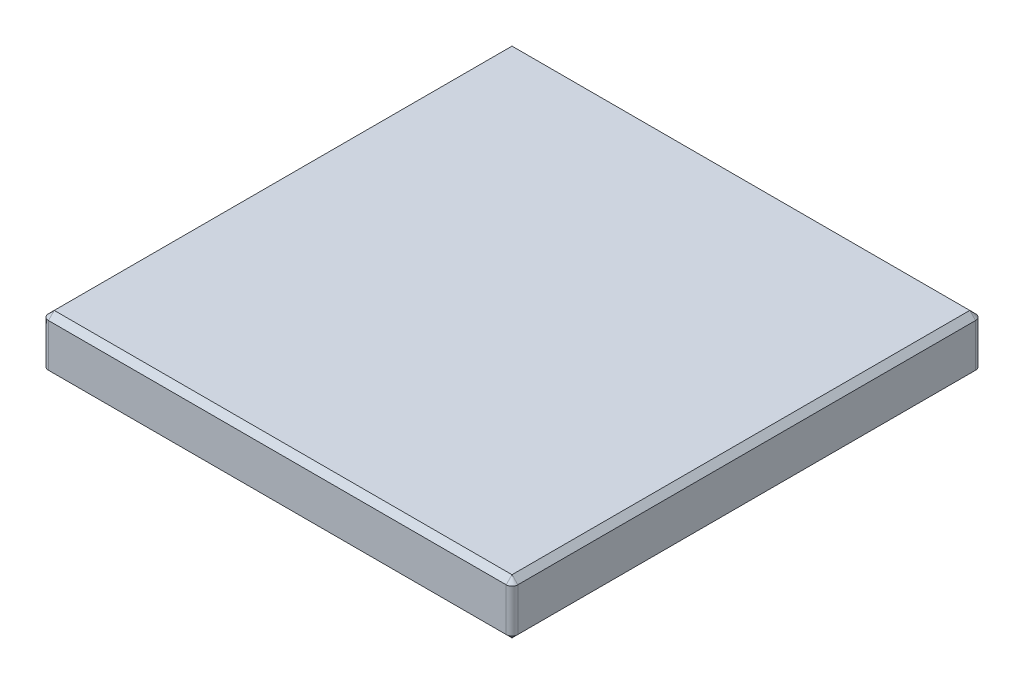
ISO-10303-21;
HEADER;
FILE_DESCRIPTION(('STEP AP214'),'2;1');
FILE_NAME('part.step','',(''),(''),'','','');
FILE_SCHEMA(('AUTOMOTIVE_DESIGN { 1 0 10303 214 1 1 1 1 }'));
ENDSEC;
DATA;
#1=APPLICATION_CONTEXT('core data for automotive mechanical design processes');
#2=APPLICATION_PROTOCOL_DEFINITION('international standard','automotive_design',2000,#1);
#3=PRODUCT_CONTEXT('',#1,'mechanical');
#4=PRODUCT('Part','Part','',(#3));
#5=PRODUCT_RELATED_PRODUCT_CATEGORY('part','',(#4));
#6=PRODUCT_DEFINITION_FORMATION('','',#4);
#7=PRODUCT_DEFINITION_CONTEXT('part definition',#1,'design');
#8=PRODUCT_DEFINITION('design','',#6,#7);
#9=PRODUCT_DEFINITION_SHAPE('','',#8);
#10=(LENGTH_UNIT() NAMED_UNIT(*) SI_UNIT(.MILLI.,.METRE.));
#11=(NAMED_UNIT(*) PLANE_ANGLE_UNIT() SI_UNIT($,.RADIAN.));
#12=(NAMED_UNIT(*) SI_UNIT($,.STERADIAN.) SOLID_ANGLE_UNIT());
#13=UNCERTAINTY_MEASURE_WITH_UNIT(LENGTH_MEASURE(1.E-05),#10,'distance_accuracy_value','');
#14=(GEOMETRIC_REPRESENTATION_CONTEXT(3) GLOBAL_UNCERTAINTY_ASSIGNED_CONTEXT((#13)) GLOBAL_UNIT_ASSIGNED_CONTEXT((#10,
#11,#12)) REPRESENTATION_CONTEXT('',''));
#15=CARTESIAN_POINT('',(0.,0.,0.));
#16=DIRECTION('',(0.,0.,1.));
#17=DIRECTION('',(1.,0.,0.));
#18=AXIS2_PLACEMENT_3D('',#15,#16,#17);
#19=CARTESIAN_POINT('',(201.5,47.,201.5));
#20=DIRECTION('',(-1.,0.,0.));
#21=DIRECTION('',(0.,0.,1.));
#22=AXIS2_PLACEMENT_3D('',#19,#20,#21);
#23=PLANE('',#22);
#24=DIRECTION('',(0.,-1.,0.));
#25=VECTOR('',#24,1.);
#26=CARTESIAN_POINT('',(201.5,47.,196.5));
#27=LINE('',#26,#25);
#28=CARTESIAN_POINT('',(201.5,42.,196.5));
#29=VERTEX_POINT('',#28);
#30=CARTESIAN_POINT('',(201.5,5.00000000000006,196.5));
#31=VERTEX_POINT('',#30);
#32=EDGE_CURVE('E151',#29,#31,#27,.T.);
#33=ORIENTED_EDGE('',*,*,#32,.T.);
#34=DIRECTION('',(0.,0.,-1.));
#35=VECTOR('',#34,1.);
#36=CARTESIAN_POINT('',(201.5,5.00000000000006,-196.5));
#37=LINE('',#36,#35);
#38=CARTESIAN_POINT('',(201.5,5.00000000000006,-196.5));
#39=VERTEX_POINT('',#38);
#40=EDGE_CURVE('E170',#31,#39,#37,.T.);
#41=ORIENTED_EDGE('',*,*,#40,.T.);
#42=DIRECTION('',(0.,-1.,0.));
#43=VECTOR('',#42,1.);
#44=CARTESIAN_POINT('',(201.5,47.,-196.5));
#45=LINE('',#44,#43);
#46=CARTESIAN_POINT('',(201.5,42.,-196.5));
#47=VERTEX_POINT('',#46);
#48=EDGE_CURVE('E503',#39,#47,#45,.F.);
#49=ORIENTED_EDGE('',*,*,#48,.T.);
#50=DIRECTION('',(0.,0.,1.));
#51=VECTOR('',#50,1.);
#52=CARTESIAN_POINT('',(201.5,42.,201.5));
#53=LINE('',#52,#51);
#54=EDGE_CURVE('E162',#47,#29,#53,.T.);
#55=ORIENTED_EDGE('',*,*,#54,.T.);
#56=EDGE_LOOP('',(#33,#41,#49,#55));
#57=FACE_BOUND('',#56,.T.);
#58=ADVANCED_FACE('F34',(#57),#23,.F.);
#59=CARTESIAN_POINT('',(-201.5,47.,-201.5));
#60=DIRECTION('',(0.,0.,1.));
#61=DIRECTION('',(1.,0.,0.));
#62=AXIS2_PLACEMENT_3D('',#59,#60,#61);
#63=PLANE('',#62);
#64=DIRECTION('',(0.,-1.,0.));
#65=VECTOR('',#64,1.);
#66=CARTESIAN_POINT('',(196.5,47.,-201.5));
#67=LINE('',#66,#65);
#68=CARTESIAN_POINT('',(196.5,42.,-201.5));
#69=VERTEX_POINT('',#68);
#70=CARTESIAN_POINT('',(196.5,5.00000000000006,-201.5));
#71=VERTEX_POINT('',#70);
#72=EDGE_CURVE('E132',#69,#71,#67,.T.);
#73=ORIENTED_EDGE('',*,*,#72,.T.);
#74=DIRECTION('',(-1.,0.,0.));
#75=VECTOR('',#74,1.);
#76=CARTESIAN_POINT('',(-196.5,5.00000000000006,-201.5));
#77=LINE('',#76,#75);
#78=CARTESIAN_POINT('',(-196.5,5.00000000000006,-201.5));
#79=VERTEX_POINT('',#78);
#80=EDGE_CURVE('E140',#71,#79,#77,.T.);
#81=ORIENTED_EDGE('',*,*,#80,.T.);
#82=DIRECTION('',(0.,-1.,0.));
#83=VECTOR('',#82,1.);
#84=CARTESIAN_POINT('',(-196.5,47.,-201.5));
#85=LINE('',#84,#83);
#86=CARTESIAN_POINT('',(-196.5,42.,-201.5));
#87=VERTEX_POINT('',#86);
#88=EDGE_CURVE('E135',#79,#87,#85,.F.);
#89=ORIENTED_EDGE('',*,*,#88,.T.);
#90=DIRECTION('',(1.,0.,0.));
#91=VECTOR('',#90,1.);
#92=CARTESIAN_POINT('',(-201.5,42.,-201.5));
#93=LINE('',#92,#91);
#94=EDGE_CURVE('E128',#87,#69,#93,.T.);
#95=ORIENTED_EDGE('',*,*,#94,.T.);
#96=EDGE_LOOP('',(#73,#81,#89,#95));
#97=FACE_BOUND('',#96,.T.);
#98=ADVANCED_FACE('F130',(#97),#63,.F.);
#99=CARTESIAN_POINT('',(-201.5,47.,201.5));
#100=DIRECTION('',(1.,0.,0.));
#101=DIRECTION('',(0.,0.,-1.));
#102=AXIS2_PLACEMENT_3D('',#99,#100,#101);
#103=PLANE('',#102);
#104=DIRECTION('',(0.,-1.,0.));
#105=VECTOR('',#104,1.);
#106=CARTESIAN_POINT('',(-201.5,47.,-196.5));
#107=LINE('',#106,#105);
#108=CARTESIAN_POINT('',(-201.5,42.,-196.5));
#109=VERTEX_POINT('',#108);
#110=CARTESIAN_POINT('',(-201.5,5.00000000000006,-196.5));
#111=VERTEX_POINT('',#110);
#112=EDGE_CURVE('E141',#109,#111,#107,.T.);
#113=ORIENTED_EDGE('',*,*,#112,.T.);
#114=DIRECTION('',(0.,0.,1.));
#115=VECTOR('',#114,1.);
#116=CARTESIAN_POINT('',(-201.5,5.00000000000006,196.5));
#117=LINE('',#116,#115);
#118=CARTESIAN_POINT('',(-201.5,5.00000000000006,196.5));
#119=VERTEX_POINT('',#118);
#120=EDGE_CURVE('E227',#111,#119,#117,.T.);
#121=ORIENTED_EDGE('',*,*,#120,.T.);
#122=DIRECTION('',(0.,-1.,0.));
#123=VECTOR('',#122,1.);
#124=CARTESIAN_POINT('',(-201.5,47.,196.5));
#125=LINE('',#124,#123);
#126=CARTESIAN_POINT('',(-201.5,42.,196.5));
#127=VERTEX_POINT('',#126);
#128=EDGE_CURVE('E263',#119,#127,#125,.F.);
#129=ORIENTED_EDGE('',*,*,#128,.T.);
#130=DIRECTION('',(0.,0.,-1.));
#131=VECTOR('',#130,1.);
#132=CARTESIAN_POINT('',(-201.5,42.,201.5));
#133=LINE('',#132,#131);
#134=EDGE_CURVE('E222',#127,#109,#133,.T.);
#135=ORIENTED_EDGE('',*,*,#134,.T.);
#136=EDGE_LOOP('',(#113,#121,#129,#135));
#137=FACE_BOUND('',#136,.T.);
#138=ADVANCED_FACE('F281',(#137),#103,.F.);
#139=CARTESIAN_POINT('',(-201.5,47.,201.5));
#140=DIRECTION('',(0.,0.,-1.));
#141=DIRECTION('',(-1.,0.,0.));
#142=AXIS2_PLACEMENT_3D('',#139,#140,#141);
#143=PLANE('',#142);
#144=DIRECTION('',(0.,-1.,0.));
#145=VECTOR('',#144,1.);
#146=CARTESIAN_POINT('',(-196.5,47.,201.5));
#147=LINE('',#146,#145);
#148=CARTESIAN_POINT('',(-196.5,42.,201.5));
#149=VERTEX_POINT('',#148);
#150=CARTESIAN_POINT('',(-196.5,5.00000000000006,201.5));
#151=VERTEX_POINT('',#150);
#152=EDGE_CURVE('E264',#149,#151,#147,.T.);
#153=ORIENTED_EDGE('',*,*,#152,.T.);
#154=DIRECTION('',(1.,0.,0.));
#155=VECTOR('',#154,1.);
#156=CARTESIAN_POINT('',(196.5,5.00000000000006,201.5));
#157=LINE('',#156,#155);
#158=CARTESIAN_POINT('',(196.5,5.00000000000006,201.5));
#159=VERTEX_POINT('',#158);
#160=EDGE_CURVE('E238',#151,#159,#157,.T.);
#161=ORIENTED_EDGE('',*,*,#160,.T.);
#162=DIRECTION('',(0.,-1.,0.));
#163=VECTOR('',#162,1.);
#164=CARTESIAN_POINT('',(196.5,47.,201.5));
#165=LINE('',#164,#163);
#166=CARTESIAN_POINT('',(196.5,42.,201.5));
#167=VERTEX_POINT('',#166);
#168=EDGE_CURVE('E252',#159,#167,#165,.F.);
#169=ORIENTED_EDGE('',*,*,#168,.T.);
#170=DIRECTION('',(-1.,0.,0.));
#171=VECTOR('',#170,1.);
#172=CARTESIAN_POINT('',(-201.5,42.,201.5));
#173=LINE('',#172,#171);
#174=EDGE_CURVE('E230',#167,#149,#173,.T.);
#175=ORIENTED_EDGE('',*,*,#174,.T.);
#176=EDGE_LOOP('',(#153,#161,#169,#175));
#177=FACE_BOUND('',#176,.T.);
#178=ADVANCED_FACE('F260',(#177),#143,.F.);
#179=CARTESIAN_POINT('',(0.,47.,0.));
#180=DIRECTION('',(0.,-1.,0.));
#181=DIRECTION('',(0.,0.,-1.));
#182=AXIS2_PLACEMENT_3D('',#179,#180,#181);
#183=PLANE('',#182);
#184=DIRECTION('',(1.,0.,0.));
#185=VECTOR('',#184,1.);
#186=CARTESIAN_POINT('',(0.,47.,196.5));
#187=LINE('',#186,#185);
#188=CARTESIAN_POINT('',(-196.5,47.,196.5));
#189=VERTEX_POINT('',#188);
#190=CARTESIAN_POINT('',(196.5,47.,196.5));
#191=VERTEX_POINT('',#190);
#192=EDGE_CURVE('E172',#189,#191,#187,.T.);
#193=ORIENTED_EDGE('',*,*,#192,.T.);
#194=DIRECTION('',(0.,0.,-1.));
#195=VECTOR('',#194,1.);
#196=CARTESIAN_POINT('',(196.5,47.,0.));
#197=LINE('',#196,#195);
#198=CARTESIAN_POINT('',(196.5,47.,-196.5));
#199=VERTEX_POINT('',#198);
#200=EDGE_CURVE('E11',#191,#199,#197,.T.);
#201=ORIENTED_EDGE('',*,*,#200,.T.);
#202=DIRECTION('',(-1.,0.,0.));
#203=VECTOR('',#202,1.);
#204=CARTESIAN_POINT('',(0.,47.,-196.5));
#205=LINE('',#204,#203);
#206=CARTESIAN_POINT('',(-196.5,47.,-196.5));
#207=VERTEX_POINT('',#206);
#208=EDGE_CURVE('E44',#199,#207,#205,.T.);
#209=ORIENTED_EDGE('',*,*,#208,.T.);
#210=DIRECTION('',(0.,0.,1.));
#211=VECTOR('',#210,1.);
#212=CARTESIAN_POINT('',(-196.5,47.,0.));
#213=LINE('',#212,#211);
#214=EDGE_CURVE('E174',#207,#189,#213,.T.);
#215=ORIENTED_EDGE('',*,*,#214,.T.);
#216=EDGE_LOOP('',(#193,#201,#209,#215));
#217=FACE_BOUND('',#216,.T.);
#218=ADVANCED_FACE('F271',(#217),#183,.F.);
#219=CARTESIAN_POINT('',(0.,0.,0.));
#220=DIRECTION('',(0.,-1.,0.));
#221=DIRECTION('',(0.,0.,-1.));
#222=AXIS2_PLACEMENT_3D('',#219,#220,#221);
#223=PLANE('',#222);
#224=DIRECTION('',(0.,0.,-1.));
#225=VECTOR('',#224,1.);
#226=CARTESIAN_POINT('',(-196.5,0.,-196.5));
#227=LINE('',#226,#225);
#228=CARTESIAN_POINT('',(-196.5,0.,196.5));
#229=VERTEX_POINT('',#228);
#230=CARTESIAN_POINT('',(-196.5,0.,-196.5));
#231=VERTEX_POINT('',#230);
#232=EDGE_CURVE('E233',#229,#231,#227,.T.);
#233=ORIENTED_EDGE('',*,*,#232,.T.);
#234=DIRECTION('',(1.,0.,0.));
#235=VECTOR('',#234,1.);
#236=CARTESIAN_POINT('',(196.5,0.,-196.5));
#237=LINE('',#236,#235);
#238=CARTESIAN_POINT('',(196.5,0.,-196.5));
#239=VERTEX_POINT('',#238);
#240=EDGE_CURVE('E228',#231,#239,#237,.T.);
#241=ORIENTED_EDGE('',*,*,#240,.T.);
#242=DIRECTION('',(0.,0.,1.));
#243=VECTOR('',#242,1.);
#244=CARTESIAN_POINT('',(196.5,0.,196.5));
#245=LINE('',#244,#243);
#246=CARTESIAN_POINT('',(196.5,0.,196.5));
#247=VERTEX_POINT('',#246);
#248=EDGE_CURVE('E493',#239,#247,#245,.T.);
#249=ORIENTED_EDGE('',*,*,#248,.T.);
#250=DIRECTION('',(-1.,0.,0.));
#251=VECTOR('',#250,1.);
#252=CARTESIAN_POINT('',(-196.5,0.,196.5));
#253=LINE('',#252,#251);
#254=EDGE_CURVE('E495',#247,#229,#253,.T.);
#255=ORIENTED_EDGE('',*,*,#254,.T.);
#256=EDGE_LOOP('',(#233,#241,#249,#255));
#257=FACE_BOUND('',#256,.T.);
#258=ADVANCED_FACE('F273',(#257),#223,.T.);
#259=CARTESIAN_POINT('',(196.5,47.,-196.5));
#260=DIRECTION('',(0.,-1.,0.));
#261=DIRECTION('',(0.,0.,-1.));
#262=AXIS2_PLACEMENT_3D('',#259,#260,#261);
#263=CYLINDRICAL_SURFACE('',#262,5.);
#264=ORIENTED_EDGE('',*,*,#48,.F.);
#265=CARTESIAN_POINT('',(196.5,5.00000000000006,-196.5));
#266=DIRECTION('',(0.,-1.,0.));
#267=DIRECTION('',(0.,0.,-1.));
#268=AXIS2_PLACEMENT_3D('',#265,#266,#267);
#269=CIRCLE('',#268,5.);
#270=EDGE_CURVE('E150',#39,#71,#269,.F.);
#271=ORIENTED_EDGE('',*,*,#270,.T.);
#272=ORIENTED_EDGE('',*,*,#72,.F.);
#273=CARTESIAN_POINT('',(196.5,42.,-196.5));
#274=DIRECTION('',(0.,-1.,0.));
#275=DIRECTION('',(0.,0.,-1.));
#276=AXIS2_PLACEMENT_3D('',#273,#274,#275);
#277=CIRCLE('',#276,5.);
#278=EDGE_CURVE('E147',#69,#47,#277,.T.);
#279=ORIENTED_EDGE('',*,*,#278,.T.);
#280=EDGE_LOOP('',(#264,#271,#272,#279));
#281=FACE_BOUND('',#280,.T.);
#282=ADVANCED_FACE('F145',(#281),#263,.T.);
#283=CARTESIAN_POINT('',(196.5,47.,196.5));
#284=DIRECTION('',(0.,-1.,0.));
#285=DIRECTION('',(0.,0.,-1.));
#286=AXIS2_PLACEMENT_3D('',#283,#284,#285);
#287=CYLINDRICAL_SURFACE('',#286,5.);
#288=ORIENTED_EDGE('',*,*,#168,.F.);
#289=CARTESIAN_POINT('',(196.5,5.00000000000006,196.5));
#290=DIRECTION('',(0.,-1.,0.));
#291=DIRECTION('',(0.,0.,-1.));
#292=AXIS2_PLACEMENT_3D('',#289,#290,#291);
#293=CIRCLE('',#292,5.);
#294=EDGE_CURVE('E160',#159,#31,#293,.F.);
#295=ORIENTED_EDGE('',*,*,#294,.T.);
#296=ORIENTED_EDGE('',*,*,#32,.F.);
#297=CARTESIAN_POINT('',(196.5,42.,196.5));
#298=DIRECTION('',(0.,-1.,0.));
#299=DIRECTION('',(0.,0.,-1.));
#300=AXIS2_PLACEMENT_3D('',#297,#298,#299);
#301=CIRCLE('',#300,5.);
#302=EDGE_CURVE('E164',#29,#167,#301,.T.);
#303=ORIENTED_EDGE('',*,*,#302,.T.);
#304=EDGE_LOOP('',(#288,#295,#296,#303));
#305=FACE_BOUND('',#304,.T.);
#306=ADVANCED_FACE('F251',(#305),#287,.T.);
#307=CARTESIAN_POINT('',(-196.5,47.,-196.5));
#308=DIRECTION('',(0.,-1.,0.));
#309=DIRECTION('',(0.,0.,-1.));
#310=AXIS2_PLACEMENT_3D('',#307,#308,#309);
#311=CYLINDRICAL_SURFACE('',#310,5.);
#312=ORIENTED_EDGE('',*,*,#88,.F.);
#313=CARTESIAN_POINT('',(-196.5,5.00000000000006,-196.5));
#314=DIRECTION('',(0.,-1.,0.));
#315=DIRECTION('',(0.,0.,-1.));
#316=AXIS2_PLACEMENT_3D('',#313,#314,#315);
#317=CIRCLE('',#316,5.);
#318=EDGE_CURVE('E245',#79,#111,#317,.F.);
#319=ORIENTED_EDGE('',*,*,#318,.T.);
#320=ORIENTED_EDGE('',*,*,#112,.F.);
#321=CARTESIAN_POINT('',(-196.5,42.,-196.5));
#322=DIRECTION('',(0.,-1.,0.));
#323=DIRECTION('',(0.,0.,-1.));
#324=AXIS2_PLACEMENT_3D('',#321,#322,#323);
#325=CIRCLE('',#324,5.);
#326=EDGE_CURVE('E243',#109,#87,#325,.T.);
#327=ORIENTED_EDGE('',*,*,#326,.T.);
#328=EDGE_LOOP('',(#312,#319,#320,#327));
#329=FACE_BOUND('',#328,.T.);
#330=ADVANCED_FACE('F296',(#329),#311,.T.);
#331=CARTESIAN_POINT('',(-196.5,47.,196.5));
#332=DIRECTION('',(0.,-1.,0.));
#333=DIRECTION('',(0.,0.,-1.));
#334=AXIS2_PLACEMENT_3D('',#331,#332,#333);
#335=CYLINDRICAL_SURFACE('',#334,5.);
#336=ORIENTED_EDGE('',*,*,#128,.F.);
#337=CARTESIAN_POINT('',(-196.5,5.00000000000006,196.5));
#338=DIRECTION('',(0.,-1.,0.));
#339=DIRECTION('',(0.,0.,-1.));
#340=AXIS2_PLACEMENT_3D('',#337,#338,#339);
#341=CIRCLE('',#340,5.);
#342=EDGE_CURVE('E241',#119,#151,#341,.F.);
#343=ORIENTED_EDGE('',*,*,#342,.T.);
#344=ORIENTED_EDGE('',*,*,#152,.F.);
#345=CARTESIAN_POINT('',(-196.5,42.,196.5));
#346=DIRECTION('',(0.,-1.,0.));
#347=DIRECTION('',(0.,0.,-1.));
#348=AXIS2_PLACEMENT_3D('',#345,#346,#347);
#349=CIRCLE('',#348,5.);
#350=EDGE_CURVE('E218',#149,#127,#349,.T.);
#351=ORIENTED_EDGE('',*,*,#350,.T.);
#352=EDGE_LOOP('',(#336,#343,#344,#351));
#353=FACE_BOUND('',#352,.T.);
#354=ADVANCED_FACE('F299',(#353),#335,.T.);
#355=CARTESIAN_POINT('',(-201.5,5.00000000000006,201.5));
#356=DIRECTION('',(0.,-0.707106781186543,0.707106781186551));
#357=DIRECTION('',(-1.,0.,0.));
#358=AXIS2_PLACEMENT_3D('',#355,#356,#357);
#359=PLANE('',#358);
#360=DIRECTION('',(0.,-0.707106781186551,-0.707106781186543));
#361=VECTOR('',#360,1.);
#362=CARTESIAN_POINT('',(196.5,5.00000000000006,201.5));
#363=LINE('',#362,#361);
#364=EDGE_CURVE('E196',#159,#247,#363,.T.);
#365=ORIENTED_EDGE('',*,*,#364,.F.);
#366=ORIENTED_EDGE('',*,*,#160,.F.);
#367=DIRECTION('',(0.,0.707106781186551,0.707106781186543));
#368=VECTOR('',#367,1.);
#369=CARTESIAN_POINT('',(-196.5,0.,196.5));
#370=LINE('',#369,#368);
#371=EDGE_CURVE('E193',#229,#151,#370,.T.);
#372=ORIENTED_EDGE('',*,*,#371,.F.);
#373=ORIENTED_EDGE('',*,*,#254,.F.);
#374=EDGE_LOOP('',(#365,#366,#372,#373));
#375=FACE_BOUND('',#374,.T.);
#376=ADVANCED_FACE('F303',(#375),#359,.T.);
#377=CARTESIAN_POINT('',(196.5,5.00000000000006,196.5));
#378=DIRECTION('',(0.,1.,0.));
#379=DIRECTION('',(0.,0.,1.));
#380=AXIS2_PLACEMENT_3D('',#377,#378,#379);
#381=CONICAL_SURFACE('',#380,5.,0.785398163397443);
#382=ORIENTED_EDGE('',*,*,#294,.F.);
#383=ORIENTED_EDGE('',*,*,#364,.T.);
#384=DIRECTION('',(-0.707106781186543,-0.707106781186551,0.));
#385=VECTOR('',#384,1.);
#386=CARTESIAN_POINT('',(201.5,5.00000000000006,196.5));
#387=LINE('',#386,#385);
#388=EDGE_CURVE('E190',#31,#247,#387,.T.);
#389=ORIENTED_EDGE('',*,*,#388,.F.);
#390=EDGE_LOOP('',(#382,#383,#389));
#391=FACE_BOUND('',#390,.T.);
#392=ADVANCED_FACE('F347',(#391),#381,.T.);
#393=CARTESIAN_POINT('',(-196.5,5.00000000000006,196.5));
#394=DIRECTION('',(0.,1.,0.));
#395=DIRECTION('',(0.,0.,1.));
#396=AXIS2_PLACEMENT_3D('',#393,#394,#395);
#397=CONICAL_SURFACE('',#396,5.,0.785398163397443);
#398=ORIENTED_EDGE('',*,*,#371,.T.);
#399=ORIENTED_EDGE('',*,*,#342,.F.);
#400=DIRECTION('',(-0.707106781186543,0.707106781186551,0.));
#401=VECTOR('',#400,1.);
#402=CARTESIAN_POINT('',(-196.5,0.,196.5));
#403=LINE('',#402,#401);
#404=EDGE_CURVE('E187',#229,#119,#403,.T.);
#405=ORIENTED_EDGE('',*,*,#404,.F.);
#406=EDGE_LOOP('',(#398,#399,#405));
#407=FACE_BOUND('',#406,.T.);
#408=ADVANCED_FACE('F340',(#407),#397,.T.);
#409=CARTESIAN_POINT('',(201.5,5.00000000000006,201.5));
#410=DIRECTION('',(0.707106781186551,-0.707106781186543,0.));
#411=DIRECTION('',(0.,0.,1.));
#412=AXIS2_PLACEMENT_3D('',#409,#410,#411);
#413=PLANE('',#412);
#414=ORIENTED_EDGE('',*,*,#388,.T.);
#415=ORIENTED_EDGE('',*,*,#248,.F.);
#416=DIRECTION('',(-0.707106781186543,-0.707106781186551,0.));
#417=VECTOR('',#416,1.);
#418=CARTESIAN_POINT('',(201.5,5.00000000000006,-196.5));
#419=LINE('',#418,#417);
#420=EDGE_CURVE('E184',#39,#239,#419,.T.);
#421=ORIENTED_EDGE('',*,*,#420,.F.);
#422=ORIENTED_EDGE('',*,*,#40,.F.);
#423=EDGE_LOOP('',(#414,#415,#421,#422));
#424=FACE_BOUND('',#423,.T.);
#425=ADVANCED_FACE('F333',(#424),#413,.T.);
#426=CARTESIAN_POINT('',(-201.5,5.00000000000006,201.5));
#427=DIRECTION('',(-0.707106781186551,-0.707106781186543,0.));
#428=DIRECTION('',(0.,0.,-1.));
#429=AXIS2_PLACEMENT_3D('',#426,#427,#428);
#430=PLANE('',#429);
#431=ORIENTED_EDGE('',*,*,#404,.T.);
#432=ORIENTED_EDGE('',*,*,#120,.F.);
#433=DIRECTION('',(-0.707106781186543,0.707106781186551,0.));
#434=VECTOR('',#433,1.);
#435=CARTESIAN_POINT('',(-196.5,0.,-196.5));
#436=LINE('',#435,#434);
#437=EDGE_CURVE('E181',#231,#111,#436,.T.);
#438=ORIENTED_EDGE('',*,*,#437,.F.);
#439=ORIENTED_EDGE('',*,*,#232,.F.);
#440=EDGE_LOOP('',(#431,#432,#438,#439));
#441=FACE_BOUND('',#440,.T.);
#442=ADVANCED_FACE('F326',(#441),#430,.T.);
#443=CARTESIAN_POINT('',(196.5,5.00000000000006,-196.5));
#444=DIRECTION('',(0.,1.,0.));
#445=DIRECTION('',(0.,0.,1.));
#446=AXIS2_PLACEMENT_3D('',#443,#444,#445);
#447=CONICAL_SURFACE('',#446,5.,0.785398163397443);
#448=ORIENTED_EDGE('',*,*,#270,.F.);
#449=ORIENTED_EDGE('',*,*,#420,.T.);
#450=DIRECTION('',(0.,-0.707106781186551,0.707106781186543));
#451=VECTOR('',#450,1.);
#452=CARTESIAN_POINT('',(196.5,5.00000000000006,-201.5));
#453=LINE('',#452,#451);
#454=EDGE_CURVE('E179',#71,#239,#453,.T.);
#455=ORIENTED_EDGE('',*,*,#454,.F.);
#456=EDGE_LOOP('',(#448,#449,#455));
#457=FACE_BOUND('',#456,.T.);
#458=ADVANCED_FACE('F319',(#457),#447,.T.);
#459=CARTESIAN_POINT('',(-196.5,5.00000000000006,-196.5));
#460=DIRECTION('',(0.,1.,0.));
#461=DIRECTION('',(0.,0.,1.));
#462=AXIS2_PLACEMENT_3D('',#459,#460,#461);
#463=CONICAL_SURFACE('',#462,5.,0.785398163397443);
#464=ORIENTED_EDGE('',*,*,#437,.T.);
#465=ORIENTED_EDGE('',*,*,#318,.F.);
#466=DIRECTION('',(0.,0.707106781186551,-0.707106781186543));
#467=VECTOR('',#466,1.);
#468=CARTESIAN_POINT('',(-196.5,0.,-196.5));
#469=LINE('',#468,#467);
#470=EDGE_CURVE('E177',#231,#79,#469,.T.);
#471=ORIENTED_EDGE('',*,*,#470,.F.);
#472=EDGE_LOOP('',(#464,#465,#471));
#473=FACE_BOUND('',#472,.T.);
#474=ADVANCED_FACE('F312',(#473),#463,.T.);
#475=CARTESIAN_POINT('',(-201.5,5.00000000000006,-201.5));
#476=DIRECTION('',(0.,-0.707106781186543,-0.707106781186551));
#477=DIRECTION('',(1.,0.,0.));
#478=AXIS2_PLACEMENT_3D('',#475,#476,#477);
#479=PLANE('',#478);
#480=ORIENTED_EDGE('',*,*,#454,.T.);
#481=ORIENTED_EDGE('',*,*,#240,.F.);
#482=ORIENTED_EDGE('',*,*,#470,.T.);
#483=ORIENTED_EDGE('',*,*,#80,.F.);
#484=EDGE_LOOP('',(#480,#481,#482,#483));
#485=FACE_BOUND('',#484,.T.);
#486=ADVANCED_FACE('F306',(#485),#479,.T.);
#487=CARTESIAN_POINT('',(-196.5,47.,0.));
#488=DIRECTION('',(0.707106781186547,-0.707106781186547,0.));
#489=DIRECTION('',(0.,0.,1.));
#490=AXIS2_PLACEMENT_3D('',#487,#488,#489);
#491=PLANE('',#490);
#492=DIRECTION('',(0.707106781186547,0.707106781186547,0.));
#493=VECTOR('',#492,1.);
#494=CARTESIAN_POINT('',(-201.5,42.,-196.5));
#495=LINE('',#494,#493);
#496=EDGE_CURVE('E207',#109,#207,#495,.T.);
#497=ORIENTED_EDGE('',*,*,#496,.F.);
#498=ORIENTED_EDGE('',*,*,#134,.F.);
#499=DIRECTION('',(-0.707106781186547,-0.707106781186547,0.));
#500=VECTOR('',#499,1.);
#501=CARTESIAN_POINT('',(-196.5,47.,196.5));
#502=LINE('',#501,#500);
#503=EDGE_CURVE('E39',#189,#127,#502,.T.);
#504=ORIENTED_EDGE('',*,*,#503,.F.);
#505=ORIENTED_EDGE('',*,*,#214,.F.);
#506=EDGE_LOOP('',(#497,#498,#504,#505));
#507=FACE_BOUND('',#506,.T.);
#508=ADVANCED_FACE('F37',(#507),#491,.F.);
#509=CARTESIAN_POINT('',(-196.5,42.,196.5));
#510=DIRECTION('',(0.,-1.,0.));
#511=DIRECTION('',(0.,0.,-1.));
#512=AXIS2_PLACEMENT_3D('',#509,#510,#511);
#513=CONICAL_SURFACE('',#512,5.,0.785398163397448);
#514=ORIENTED_EDGE('',*,*,#503,.T.);
#515=ORIENTED_EDGE('',*,*,#350,.F.);
#516=DIRECTION('',(0.,-0.707106781186547,0.707106781186547));
#517=VECTOR('',#516,1.);
#518=CARTESIAN_POINT('',(-196.5,47.,196.5));
#519=LINE('',#518,#517);
#520=EDGE_CURVE('E205',#189,#149,#519,.T.);
#521=ORIENTED_EDGE('',*,*,#520,.F.);
#522=EDGE_LOOP('',(#514,#515,#521));
#523=FACE_BOUND('',#522,.T.);
#524=ADVANCED_FACE('F217',(#523),#513,.T.);
#525=CARTESIAN_POINT('',(-196.5,42.,-196.5));
#526=DIRECTION('',(0.,-1.,0.));
#527=DIRECTION('',(0.,0.,-1.));
#528=AXIS2_PLACEMENT_3D('',#525,#526,#527);
#529=CONICAL_SURFACE('',#528,5.,0.785398163397448);
#530=ORIENTED_EDGE('',*,*,#326,.F.);
#531=ORIENTED_EDGE('',*,*,#496,.T.);
#532=DIRECTION('',(0.,0.707106781186547,0.707106781186547));
#533=VECTOR('',#532,1.);
#534=CARTESIAN_POINT('',(-196.5,42.,-201.5));
#535=LINE('',#534,#533);
#536=EDGE_CURVE('E203',#87,#207,#535,.T.);
#537=ORIENTED_EDGE('',*,*,#536,.F.);
#538=EDGE_LOOP('',(#530,#531,#537));
#539=FACE_BOUND('',#538,.T.);
#540=ADVANCED_FACE('F386',(#539),#529,.T.);
#541=CARTESIAN_POINT('',(0.,47.,196.5));
#542=DIRECTION('',(0.,-0.707106781186547,-0.707106781186547));
#543=DIRECTION('',(1.,0.,0.));
#544=AXIS2_PLACEMENT_3D('',#541,#542,#543);
#545=PLANE('',#544);
#546=ORIENTED_EDGE('',*,*,#520,.T.);
#547=ORIENTED_EDGE('',*,*,#174,.F.);
#548=DIRECTION('',(0.,-0.707106781186547,0.707106781186547));
#549=VECTOR('',#548,1.);
#550=CARTESIAN_POINT('',(196.5,47.,196.5));
#551=LINE('',#550,#549);
#552=EDGE_CURVE('E156',#191,#167,#551,.T.);
#553=ORIENTED_EDGE('',*,*,#552,.F.);
#554=ORIENTED_EDGE('',*,*,#192,.F.);
#555=EDGE_LOOP('',(#546,#547,#553,#554));
#556=FACE_BOUND('',#555,.T.);
#557=ADVANCED_FACE('F268',(#556),#545,.F.);
#558=CARTESIAN_POINT('',(0.,47.,-196.5));
#559=DIRECTION('',(0.,-0.707106781186547,0.707106781186547));
#560=DIRECTION('',(-1.,0.,0.));
#561=AXIS2_PLACEMENT_3D('',#558,#559,#560);
#562=PLANE('',#561);
#563=ORIENTED_EDGE('',*,*,#536,.T.);
#564=ORIENTED_EDGE('',*,*,#208,.F.);
#565=DIRECTION('',(0.,0.707106781186547,0.707106781186547));
#566=VECTOR('',#565,1.);
#567=CARTESIAN_POINT('',(196.5,42.,-201.5));
#568=LINE('',#567,#566);
#569=EDGE_CURVE('E153',#69,#199,#568,.T.);
#570=ORIENTED_EDGE('',*,*,#569,.F.);
#571=ORIENTED_EDGE('',*,*,#94,.F.);
#572=EDGE_LOOP('',(#563,#564,#570,#571));
#573=FACE_BOUND('',#572,.T.);
#574=ADVANCED_FACE('F154',(#573),#562,.F.);
#575=CARTESIAN_POINT('',(196.5,42.,196.5));
#576=DIRECTION('',(0.,-1.,0.));
#577=DIRECTION('',(0.,0.,-1.));
#578=AXIS2_PLACEMENT_3D('',#575,#576,#577);
#579=CONICAL_SURFACE('',#578,5.,0.785398163397448);
#580=ORIENTED_EDGE('',*,*,#552,.T.);
#581=ORIENTED_EDGE('',*,*,#302,.F.);
#582=DIRECTION('',(0.707106781186547,-0.707106781186547,0.));
#583=VECTOR('',#582,1.);
#584=CARTESIAN_POINT('',(196.5,47.,196.5));
#585=LINE('',#584,#583);
#586=EDGE_CURVE('E157',#191,#29,#585,.T.);
#587=ORIENTED_EDGE('',*,*,#586,.F.);
#588=EDGE_LOOP('',(#580,#581,#587));
#589=FACE_BOUND('',#588,.T.);
#590=ADVANCED_FACE('F269',(#589),#579,.T.);
#591=CARTESIAN_POINT('',(196.5,42.,-196.5));
#592=DIRECTION('',(0.,-1.,0.));
#593=DIRECTION('',(0.,0.,-1.));
#594=AXIS2_PLACEMENT_3D('',#591,#592,#593);
#595=CONICAL_SURFACE('',#594,5.,0.785398163397448);
#596=ORIENTED_EDGE('',*,*,#278,.F.);
#597=ORIENTED_EDGE('',*,*,#569,.T.);
#598=DIRECTION('',(-0.707106781186547,0.707106781186547,0.));
#599=VECTOR('',#598,1.);
#600=CARTESIAN_POINT('',(201.5,42.,-196.5));
#601=LINE('',#600,#599);
#602=EDGE_CURVE('E52',#47,#199,#601,.T.);
#603=ORIENTED_EDGE('',*,*,#602,.F.);
#604=EDGE_LOOP('',(#596,#597,#603));
#605=FACE_BOUND('',#604,.T.);
#606=ADVANCED_FACE('F159',(#605),#595,.T.);
#607=CARTESIAN_POINT('',(196.5,47.,0.));
#608=DIRECTION('',(-0.707106781186547,-0.707106781186547,0.));
#609=DIRECTION('',(0.,0.,-1.));
#610=AXIS2_PLACEMENT_3D('',#607,#608,#609);
#611=PLANE('',#610);
#612=ORIENTED_EDGE('',*,*,#586,.T.);
#613=ORIENTED_EDGE('',*,*,#54,.F.);
#614=ORIENTED_EDGE('',*,*,#602,.T.);
#615=ORIENTED_EDGE('',*,*,#200,.F.);
#616=EDGE_LOOP('',(#612,#613,#614,#615));
#617=FACE_BOUND('',#616,.T.);
#618=ADVANCED_FACE('F270',(#617),#611,.F.);
#619=CLOSED_SHELL('',(#58,#98,#138,#178,#218,#258,#282,#306,#330,#354,#376,#392,#408,#425,#442,
#458,#474,#486,#508,#524,#540,#557,#574,#590,#606,#618));
#620=MANIFOLD_SOLID_BREP('B2',#619);
#621=ADVANCED_BREP_SHAPE_REPRESENTATION('',(#18,#620),#14);
#622=SHAPE_DEFINITION_REPRESENTATION(#9,#621);
ENDSEC;
END-ISO-10303-21;
